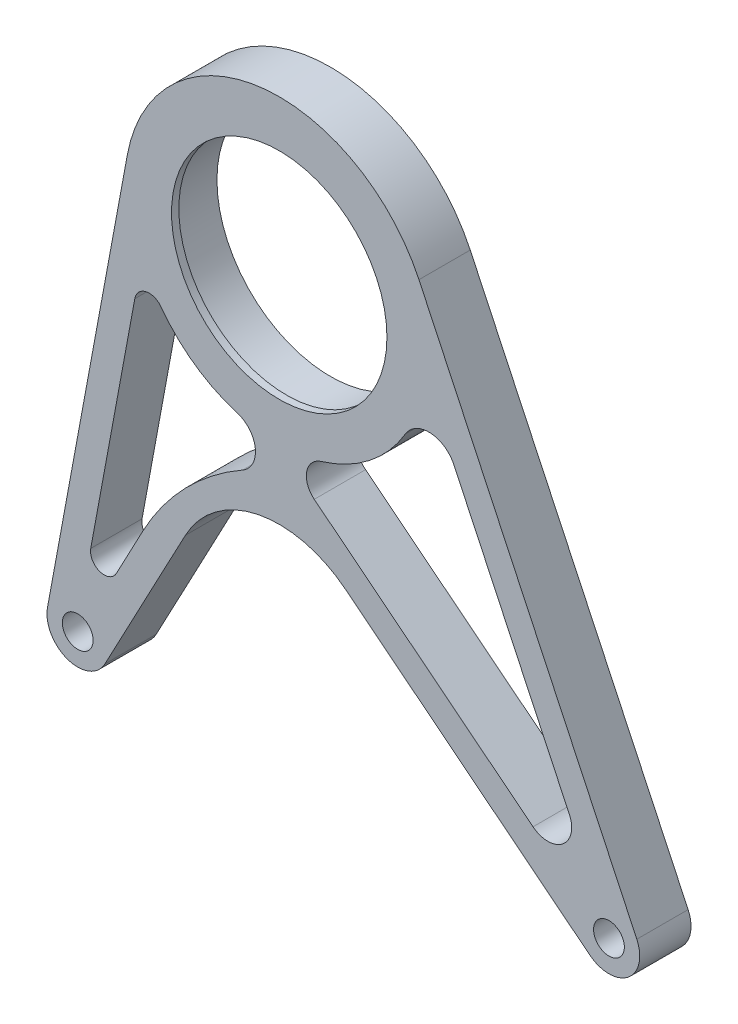
ISO-10303-21;
HEADER;
FILE_DESCRIPTION(('STEP AP214'),'2;1');
FILE_NAME('part.step','',(''),(''),'','','');
FILE_SCHEMA(('AUTOMOTIVE_DESIGN { 1 0 10303 214 1 1 1 1 }'));
ENDSEC;
DATA;
#1=APPLICATION_CONTEXT('core data for automotive mechanical design processes');
#2=APPLICATION_PROTOCOL_DEFINITION('international standard','automotive_design',2000,#1);
#3=PRODUCT_CONTEXT('',#1,'mechanical');
#4=PRODUCT('Part','Part','',(#3));
#5=PRODUCT_RELATED_PRODUCT_CATEGORY('part','',(#4));
#6=PRODUCT_DEFINITION_FORMATION('','',#4);
#7=PRODUCT_DEFINITION_CONTEXT('part definition',#1,'design');
#8=PRODUCT_DEFINITION('design','',#6,#7);
#9=PRODUCT_DEFINITION_SHAPE('','',#8);
#10=(LENGTH_UNIT() NAMED_UNIT(*) SI_UNIT(.MILLI.,.METRE.));
#11=(NAMED_UNIT(*) PLANE_ANGLE_UNIT() SI_UNIT($,.RADIAN.));
#12=(NAMED_UNIT(*) SI_UNIT($,.STERADIAN.) SOLID_ANGLE_UNIT());
#13=UNCERTAINTY_MEASURE_WITH_UNIT(LENGTH_MEASURE(1.E-05),#10,'distance_accuracy_value','');
#14=(GEOMETRIC_REPRESENTATION_CONTEXT(3) GLOBAL_UNCERTAINTY_ASSIGNED_CONTEXT((#13)) GLOBAL_UNIT_ASSIGNED_CONTEXT((#10,
#11,#12)) REPRESENTATION_CONTEXT('',''));
#15=CARTESIAN_POINT('',(0.,0.,0.));
#16=DIRECTION('',(0.,0.,1.));
#17=DIRECTION('',(1.,0.,0.));
#18=AXIS2_PLACEMENT_3D('',#15,#16,#17);
#19=CARTESIAN_POINT('',(0.,0.,-7.));
#20=DIRECTION('',(0.,0.,1.));
#21=DIRECTION('',(1.,0.,0.));
#22=AXIS2_PLACEMENT_3D('',#19,#20,#21);
#23=CYLINDRICAL_SURFACE('',#22,31.);
#24=CARTESIAN_POINT('',(0.,0.,-7.));
#25=DIRECTION('',(0.,0.,1.));
#26=DIRECTION('',(1.,0.,0.));
#27=AXIS2_PLACEMENT_3D('',#24,#25,#26);
#28=CIRCLE('',#27,31.);
#29=CARTESIAN_POINT('',(31.,0.,-7.));
#30=VERTEX_POINT('',#29);
#31=EDGE_CURVE('E345',#30,#30,#28,.T.);
#32=ORIENTED_EDGE('',*,*,#31,.F.);
#33=EDGE_LOOP('',(#32));
#34=FACE_BOUND('',#33,.T.);
#35=CARTESIAN_POINT('',(0.,0.,5.));
#36=DIRECTION('',(0.,0.,1.));
#37=DIRECTION('',(1.,0.,0.));
#38=AXIS2_PLACEMENT_3D('',#35,#36,#37);
#39=CIRCLE('',#38,31.);
#40=CARTESIAN_POINT('',(31.,0.,5.));
#41=VERTEX_POINT('',#40);
#42=EDGE_CURVE('E11',#41,#41,#39,.F.);
#43=ORIENTED_EDGE('',*,*,#42,.F.);
#44=EDGE_LOOP('',(#43));
#45=FACE_BOUND('',#44,.T.);
#46=ADVANCED_FACE('F47',(#34,#45),#23,.F.);
#47=CARTESIAN_POINT('',(0.,0.,7.));
#48=DIRECTION('',(0.,0.,-1.));
#49=DIRECTION('',(-1.,0.,0.));
#50=AXIS2_PLACEMENT_3D('',#47,#48,#49);
#51=CYLINDRICAL_SURFACE('',#50,42.16);
#52=CARTESIAN_POINT('',(0.,0.,-7.));
#53=DIRECTION('',(0.,0.,1.));
#54=DIRECTION('',(1.,0.,0.));
#55=AXIS2_PLACEMENT_3D('',#52,#53,#54);
#56=CIRCLE('',#55,42.16);
#57=CARTESIAN_POINT('',(38.1369015279032,17.973378698815,-7.));
#58=VERTEX_POINT('',#57);
#59=CARTESIAN_POINT('',(-41.4572657344942,7.66555397995015,-7.));
#60=VERTEX_POINT('',#59);
#61=EDGE_CURVE('E353',#58,#60,#56,.T.);
#62=ORIENTED_EDGE('',*,*,#61,.T.);
#63=DIRECTION('',(0.,0.,-1.));
#64=VECTOR('',#63,1.);
#65=CARTESIAN_POINT('',(-41.4572657344942,7.66555397995015,7.));
#66=LINE('',#65,#64);
#67=CARTESIAN_POINT('',(-41.4572657344942,7.66555397995015,7.));
#68=VERTEX_POINT('',#67);
#69=EDGE_CURVE('E56',#68,#60,#66,.T.);
#70=ORIENTED_EDGE('',*,*,#69,.F.);
#71=CARTESIAN_POINT('',(0.,0.,7.));
#72=DIRECTION('',(0.,0.,1.));
#73=DIRECTION('',(1.,0.,0.));
#74=AXIS2_PLACEMENT_3D('',#71,#72,#73);
#75=CIRCLE('',#74,42.16);
#76=CARTESIAN_POINT('',(38.1369015279032,17.973378698815,7.));
#77=VERTEX_POINT('',#76);
#78=EDGE_CURVE('E369',#77,#68,#75,.T.);
#79=ORIENTED_EDGE('',*,*,#78,.F.);
#80=DIRECTION('',(0.,0.,-1.));
#81=VECTOR('',#80,1.);
#82=CARTESIAN_POINT('',(38.1369015279032,17.973378698815,7.));
#83=LINE('',#82,#81);
#84=EDGE_CURVE('E397',#77,#58,#83,.T.);
#85=ORIENTED_EDGE('',*,*,#84,.T.);
#86=EDGE_LOOP('',(#62,#70,#79,#85));
#87=FACE_BOUND('',#86,.T.);
#88=ADVANCED_FACE('F49',(#87),#51,.T.);
#89=CARTESIAN_POINT('',(-41.4572657344942,7.66555397995015,7.));
#90=DIRECTION('',(0.983331729945309,-0.181820540321398,0.));
#91=DIRECTION('',(0.181820540321398,0.983331729945309,0.));
#92=AXIS2_PLACEMENT_3D('',#89,#90,#91);
#93=PLANE('',#92);
#94=DIRECTION('',(-0.181820540321398,-0.983331729945309,0.));
#95=VECTOR('',#94,1.);
#96=CARTESIAN_POINT('',(-41.4572657344942,7.66555397995015,-7.));
#97=LINE('',#96,#95);
#98=CARTESIAN_POINT('',(-63.2599865315406,-110.249105832283,-7.));
#99=VERTEX_POINT('',#98);
#100=EDGE_CURVE('E401',#60,#99,#97,.T.);
#101=ORIENTED_EDGE('',*,*,#100,.T.);
#102=DIRECTION('',(0.,0.,-1.));
#103=VECTOR('',#102,1.);
#104=CARTESIAN_POINT('',(-63.2599865315406,-110.249105832283,7.));
#105=LINE('',#104,#103);
#106=CARTESIAN_POINT('',(-63.2599865315406,-110.249105832283,7.));
#107=VERTEX_POINT('',#106);
#108=EDGE_CURVE('E445',#107,#99,#105,.T.);
#109=ORIENTED_EDGE('',*,*,#108,.F.);
#110=DIRECTION('',(-0.181820540321398,-0.983331729945309,0.));
#111=VECTOR('',#110,1.);
#112=CARTESIAN_POINT('',(-41.4572657344942,7.66555397995015,7.));
#113=LINE('',#112,#111);
#114=EDGE_CURVE('E373',#68,#107,#113,.T.);
#115=ORIENTED_EDGE('',*,*,#114,.F.);
#116=ORIENTED_EDGE('',*,*,#69,.T.);
#117=EDGE_LOOP('',(#101,#109,#115,#116));
#118=FACE_BOUND('',#117,.T.);
#119=ADVANCED_FACE('F451',(#118),#93,.F.);
#120=CARTESIAN_POINT('',(-55.,-111.776398370983,7.));
#121=DIRECTION('',(0.,0.,-1.));
#122=DIRECTION('',(-1.,0.,0.));
#123=AXIS2_PLACEMENT_3D('',#120,#121,#122);
#124=CYLINDRICAL_SURFACE('',#123,8.4);
#125=CARTESIAN_POINT('',(-55.,-111.776398370983,-7.));
#126=DIRECTION('',(0.,0.,-1.));
#127=DIRECTION('',(-1.,0.,0.));
#128=AXIS2_PLACEMENT_3D('',#125,#126,#127);
#129=CIRCLE('',#128,8.4);
#130=CARTESIAN_POINT('',(-47.5799810619532,-115.713823793645,-7.));
#131=VERTEX_POINT('',#130);
#132=EDGE_CURVE('E405',#131,#99,#129,.T.);
#133=ORIENTED_EDGE('',*,*,#132,.F.);
#134=DIRECTION('',(0.,0.,-1.));
#135=VECTOR('',#134,1.);
#136=CARTESIAN_POINT('',(-47.5799810619532,-115.713823793645,7.));
#137=LINE('',#136,#135);
#138=CARTESIAN_POINT('',(-47.5799810619532,-115.713823793645,7.));
#139=VERTEX_POINT('',#138);
#140=EDGE_CURVE('E442',#139,#131,#137,.T.);
#141=ORIENTED_EDGE('',*,*,#140,.F.);
#142=CARTESIAN_POINT('',(-55.,-111.776398370983,7.));
#143=DIRECTION('',(0.,0.,-1.));
#144=DIRECTION('',(-1.,0.,0.));
#145=AXIS2_PLACEMENT_3D('',#142,#143,#144);
#146=CIRCLE('',#145,8.4);
#147=EDGE_CURVE('E377',#139,#107,#146,.T.);
#148=ORIENTED_EDGE('',*,*,#147,.T.);
#149=ORIENTED_EDGE('',*,*,#108,.T.);
#150=EDGE_LOOP('',(#133,#141,#148,#149));
#151=FACE_BOUND('',#150,.T.);
#152=ADVANCED_FACE('F464',(#151),#124,.T.);
#153=CARTESIAN_POINT('',(-47.5799810619532,-115.713823793645,7.));
#154=DIRECTION('',(-0.883335587862711,0.468741121745509,0.));
#155=DIRECTION('',(-0.468741121745509,-0.883335587862711,0.));
#156=AXIS2_PLACEMENT_3D('',#153,#154,#155);
#157=PLANE('',#156);
#158=DIRECTION('',(0.468741121745509,0.883335587862711,0.));
#159=VECTOR('',#158,1.);
#160=CARTESIAN_POINT('',(-47.5799810619532,-115.713823793645,-7.));
#161=LINE('',#160,#159);
#162=CARTESIAN_POINT('',(-25.6167320480186,-74.3244116446675,-7.));
#163=VERTEX_POINT('',#162);
#164=EDGE_CURVE('E409',#131,#163,#161,.T.);
#165=ORIENTED_EDGE('',*,*,#164,.T.);
#166=DIRECTION('',(0.,0.,-1.));
#167=VECTOR('',#166,1.);
#168=CARTESIAN_POINT('',(-25.6167320480186,-74.3244116446675,7.));
#169=LINE('',#168,#167);
#170=CARTESIAN_POINT('',(-25.6167320480186,-74.3244116446675,7.));
#171=VERTEX_POINT('',#170);
#172=EDGE_CURVE('E439',#171,#163,#169,.T.);
#173=ORIENTED_EDGE('',*,*,#172,.F.);
#174=DIRECTION('',(0.468741121745509,0.883335587862711,0.));
#175=VECTOR('',#174,1.);
#176=CARTESIAN_POINT('',(-47.5799810619532,-115.713823793645,7.));
#177=LINE('',#176,#175);
#178=EDGE_CURVE('E381',#139,#171,#177,.T.);
#179=ORIENTED_EDGE('',*,*,#178,.F.);
#180=ORIENTED_EDGE('',*,*,#140,.T.);
#181=EDGE_LOOP('',(#165,#173,#179,#180));
#182=FACE_BOUND('',#181,.T.);
#183=ADVANCED_FACE('F486',(#182),#157,.F.);
#184=CARTESIAN_POINT('',(0.,-87.9179041752873,7.));
#185=DIRECTION('',(0.,0.,-1.));
#186=DIRECTION('',(-1.,0.,0.));
#187=AXIS2_PLACEMENT_3D('',#184,#185,#186);
#188=CYLINDRICAL_SURFACE('',#187,29.);
#189=CARTESIAN_POINT('',(0.,-87.9179041752873,-7.));
#190=DIRECTION('',(0.,0.,1.));
#191=DIRECTION('',(1.,0.,0.));
#192=AXIS2_PLACEMENT_3D('',#189,#190,#191);
#193=CIRCLE('',#192,29.);
#194=CARTESIAN_POINT('',(18.0650405444432,-65.2319104759224,-7.));
#195=VERTEX_POINT('',#194);
#196=EDGE_CURVE('E413',#195,#163,#193,.T.);
#197=ORIENTED_EDGE('',*,*,#196,.F.);
#198=DIRECTION('',(0.,0.,-1.));
#199=VECTOR('',#198,1.);
#200=CARTESIAN_POINT('',(18.0650405444432,-65.2319104759224,7.));
#201=LINE('',#200,#199);
#202=CARTESIAN_POINT('',(18.0650405444432,-65.2319104759224,7.));
#203=VERTEX_POINT('',#202);
#204=EDGE_CURVE('E436',#203,#195,#201,.T.);
#205=ORIENTED_EDGE('',*,*,#204,.F.);
#206=CARTESIAN_POINT('',(0.,-87.9179041752873,7.));
#207=DIRECTION('',(0.,0.,1.));
#208=DIRECTION('',(1.,0.,0.));
#209=AXIS2_PLACEMENT_3D('',#206,#207,#208);
#210=CIRCLE('',#209,29.);
#211=EDGE_CURVE('E384',#203,#171,#210,.T.);
#212=ORIENTED_EDGE('',*,*,#211,.T.);
#213=ORIENTED_EDGE('',*,*,#172,.T.);
#214=EDGE_LOOP('',(#197,#205,#212,#213));
#215=FACE_BOUND('',#214,.T.);
#216=ADVANCED_FACE('F483',(#215),#188,.F.);
#217=CARTESIAN_POINT('',(18.0650405444432,-65.2319104759224,7.));
#218=DIRECTION('',(0.622932432567007,0.782275644805686,0.));
#219=DIRECTION('',(-0.782275644805686,0.622932432567007,0.));
#220=AXIS2_PLACEMENT_3D('',#217,#218,#219);
#221=PLANE('',#220);
#222=DIRECTION('',(0.782275644805686,-0.622932432567007,0.));
#223=VECTOR('',#222,1.);
#224=CARTESIAN_POINT('',(18.0650405444432,-65.2319104759224,-7.));
#225=LINE('',#224,#223);
#226=CARTESIAN_POINT('',(84.7673675664371,-118.347513787351,-7.));
#227=VERTEX_POINT('',#226);
#228=EDGE_CURVE('E417',#195,#227,#225,.T.);
#229=ORIENTED_EDGE('',*,*,#228,.T.);
#230=DIRECTION('',(0.,0.,-1.));
#231=VECTOR('',#230,1.);
#232=CARTESIAN_POINT('',(84.7673675664371,-118.347513787351,7.));
#233=LINE('',#232,#231);
#234=CARTESIAN_POINT('',(84.7673675664371,-118.347513787351,7.));
#235=VERTEX_POINT('',#234);
#236=EDGE_CURVE('E432',#235,#227,#233,.T.);
#237=ORIENTED_EDGE('',*,*,#236,.F.);
#238=DIRECTION('',(0.782275644805686,-0.622932432567007,0.));
#239=VECTOR('',#238,1.);
#240=CARTESIAN_POINT('',(18.0650405444432,-65.2319104759224,7.));
#241=LINE('',#240,#239);
#242=EDGE_CURVE('E388',#203,#235,#241,.T.);
#243=ORIENTED_EDGE('',*,*,#242,.F.);
#244=ORIENTED_EDGE('',*,*,#204,.T.);
#245=EDGE_LOOP('',(#229,#237,#243,#244));
#246=FACE_BOUND('',#245,.T.);
#247=ADVANCED_FACE('F493',(#246),#221,.F.);
#248=CARTESIAN_POINT('',(90.,-111.776398370983,7.));
#249=DIRECTION('',(0.,0.,-1.));
#250=DIRECTION('',(-1.,0.,0.));
#251=AXIS2_PLACEMENT_3D('',#248,#249,#250);
#252=CYLINDRICAL_SURFACE('',#251,8.39999999999999);
#253=CARTESIAN_POINT('',(90.,-111.776398370983,-7.));
#254=DIRECTION('',(0.,0.,1.));
#255=DIRECTION('',(1.,0.,0.));
#256=AXIS2_PLACEMENT_3D('',#253,#254,#255);
#257=CIRCLE('',#256,8.39999999999999);
#258=CARTESIAN_POINT('',(97.5984338907587,-108.195364664388,-7.));
#259=VERTEX_POINT('',#258);
#260=EDGE_CURVE('E420',#227,#259,#257,.T.);
#261=ORIENTED_EDGE('',*,*,#260,.T.);
#262=DIRECTION('',(0.,0.,-1.));
#263=VECTOR('',#262,1.);
#264=CARTESIAN_POINT('',(97.5984338907587,-108.195364664388,7.));
#265=LINE('',#264,#263);
#266=CARTESIAN_POINT('',(97.5984338907587,-108.195364664388,7.));
#267=VERTEX_POINT('',#266);
#268=EDGE_CURVE('E428',#267,#259,#265,.T.);
#269=ORIENTED_EDGE('',*,*,#268,.F.);
#270=CARTESIAN_POINT('',(90.,-111.776398370983,7.));
#271=DIRECTION('',(0.,0.,1.));
#272=DIRECTION('',(1.,0.,0.));
#273=AXIS2_PLACEMENT_3D('',#270,#271,#272);
#274=CIRCLE('',#273,8.39999999999999);
#275=EDGE_CURVE('E391',#235,#267,#274,.T.);
#276=ORIENTED_EDGE('',*,*,#275,.F.);
#277=ORIENTED_EDGE('',*,*,#236,.T.);
#278=EDGE_LOOP('',(#261,#269,#276,#277));
#279=FACE_BOUND('',#278,.T.);
#280=ADVANCED_FACE('F477',(#279),#252,.T.);
#281=CARTESIAN_POINT('',(97.5984338907587,-108.195364664388,7.));
#282=DIRECTION('',(-0.904575463185559,-0.426313536499407,0.));
#283=DIRECTION('',(0.426313536499407,-0.904575463185559,0.));
#284=AXIS2_PLACEMENT_3D('',#281,#282,#283);
#285=PLANE('',#284);
#286=DIRECTION('',(-0.426313536499407,0.904575463185559,0.));
#287=VECTOR('',#286,1.);
#288=CARTESIAN_POINT('',(97.5984338907587,-108.195364664388,-7.));
#289=LINE('',#288,#287);
#290=EDGE_CURVE('E374',#259,#58,#289,.T.);
#291=ORIENTED_EDGE('',*,*,#290,.T.);
#292=ORIENTED_EDGE('',*,*,#84,.F.);
#293=DIRECTION('',(-0.426313536499407,0.904575463185559,0.));
#294=VECTOR('',#293,1.);
#295=CARTESIAN_POINT('',(97.5984338907587,-108.195364664388,7.));
#296=LINE('',#295,#294);
#297=EDGE_CURVE('E394',#267,#77,#296,.T.);
#298=ORIENTED_EDGE('',*,*,#297,.F.);
#299=ORIENTED_EDGE('',*,*,#268,.T.);
#300=EDGE_LOOP('',(#291,#292,#298,#299));
#301=FACE_BOUND('',#300,.T.);
#302=ADVANCED_FACE('F475',(#301),#285,.F.);
#303=CARTESIAN_POINT('',(0.,0.,7.));
#304=DIRECTION('',(0.,0.,1.));
#305=DIRECTION('',(1.,0.,0.));
#306=AXIS2_PLACEMENT_3D('',#303,#304,#305);
#307=PLANE('',#306);
#308=CARTESIAN_POINT('',(-13.4809619477753,-45.0251448077919,7.));
#309=DIRECTION('',(0.,0.,-1.));
#310=DIRECTION('',(-1.,0.,0.));
#311=AXIS2_PLACEMENT_3D('',#308,#309,#310);
#312=CIRCLE('',#311,7.);
#313=CARTESIAN_POINT('',(-11.4731591044896,-38.3192721768442,7.));
#314=VERTEX_POINT('',#313);
#315=CARTESIAN_POINT('',(-10.0182529245116,-51.1087002008337,7.));
#316=VERTEX_POINT('',#315);
#317=EDGE_CURVE('E195',#314,#316,#312,.T.);
#318=ORIENTED_EDGE('',*,*,#317,.T.);
#319=CARTESIAN_POINT('',(24.6088373081258,-111.944254131252,7.));
#320=DIRECTION('',(0.,0.,1.));
#321=DIRECTION('',(-1.,0.,0.));
#322=AXIS2_PLACEMENT_3D('',#319,#320,#321);
#323=CIRCLE('',#322,70.);
#324=CARTESIAN_POINT('',(-37.224653842264,-79.1323756090661,7.));
#325=VERTEX_POINT('',#324);
#326=EDGE_CURVE('E207',#316,#325,#323,.T.);
#327=ORIENTED_EDGE('',*,*,#326,.T.);
#328=DIRECTION('',(-0.468741121745509,-0.883335587862712,0.));
#329=VECTOR('',#328,1.);
#330=CARTESIAN_POINT('',(-44.4654610376625,-92.7775677712771,7.));
#331=LINE('',#330,#329);
#332=CARTESIAN_POINT('',(-44.4654610376625,-92.7775677712771,7.));
#333=VERTEX_POINT('',#332);
#334=EDGE_CURVE('E63',#325,#333,#331,.T.);
#335=ORIENTED_EDGE('',*,*,#334,.T.);
#336=CARTESIAN_POINT('',(-47.7678757327288,-91.0251448077919,7.));
#337=DIRECTION('',(0.,0.,-1.));
#338=DIRECTION('',(-1.,0.,0.));
#339=AXIS2_PLACEMENT_3D('',#336,#337,#338);
#340=CIRCLE('',#339,3.73857313170948);
#341=CARTESIAN_POINT('',(-51.4441333178597,-90.3453954209535,7.));
#342=VERTEX_POINT('',#341);
#343=EDGE_CURVE('E226',#333,#342,#340,.T.);
#344=ORIENTED_EDGE('',*,*,#343,.T.);
#345=DIRECTION('',(0.181820540321398,0.983331729945309,0.));
#346=VECTOR('',#345,1.);
#347=CARTESIAN_POINT('',(-39.4165998924763,-25.2974353321151,7.));
#348=LINE('',#347,#346);
#349=CARTESIAN_POINT('',(-39.4165998924763,-25.2974353321151,7.));
#350=VERTEX_POINT('',#349);
#351=EDGE_CURVE('E230',#342,#350,#348,.T.);
#352=ORIENTED_EDGE('',*,*,#351,.T.);
#353=CARTESIAN_POINT('',(-35.4809619477753,-26.0251448077919,7.));
#354=DIRECTION('',(0.,0.,-1.));
#355=DIRECTION('',(-1.,0.,0.));
#356=AXIS2_PLACEMENT_3D('',#353,#354,#355);
#357=CIRCLE('',#356,4.00235019866575);
#358=CARTESIAN_POINT('',(-32.2536971662492,-23.657958895642,7.));
#359=VERTEX_POINT('',#358);
#360=EDGE_CURVE('E234',#350,#359,#357,.T.);
#361=ORIENTED_EDGE('',*,*,#360,.T.);
#362=CARTESIAN_POINT('',(0.,0.,7.));
#363=DIRECTION('',(0.,0.,1.));
#364=DIRECTION('',(-1.,0.,0.));
#365=AXIS2_PLACEMENT_3D('',#362,#363,#364);
#366=CIRCLE('',#365,40.);
#367=EDGE_CURVE('E204',#359,#314,#366,.T.);
#368=ORIENTED_EDGE('',*,*,#367,.T.);
#369=EDGE_LOOP('',(#318,#327,#335,#344,#352,#361,#368));
#370=FACE_BOUND('',#369,.T.);
#371=CARTESIAN_POINT('',(40.8755506487877,-24.1958541729445,7.));
#372=DIRECTION('',(0.,0.,-1.));
#373=DIRECTION('',(-1.,0.,0.));
#374=AXIS2_PLACEMENT_3D('',#371,#372,#373);
#375=CIRCLE('',#374,7.5);
#376=CARTESIAN_POINT('',(34.4215163358212,-20.3754561456375,7.));
#377=VERTEX_POINT('',#376);
#378=CARTESIAN_POINT('',(47.6598666226794,-20.9985026491989,7.));
#379=VERTEX_POINT('',#378);
#380=EDGE_CURVE('E303',#377,#379,#375,.T.);
#381=ORIENTED_EDGE('',*,*,#380,.T.);
#382=DIRECTION('',(0.426313536499407,-0.904575463185559,0.));
#383=VECTOR('',#382,1.);
#384=CARTESIAN_POINT('',(47.6598666226794,-20.9985026491989,7.));
#385=LINE('',#384,#383);
#386=CARTESIAN_POINT('',(79.2024865500148,-87.9273650661568,7.));
#387=VERTEX_POINT('',#386);
#388=EDGE_CURVE('E334',#379,#387,#385,.T.);
#389=ORIENTED_EDGE('',*,*,#388,.T.);
#390=CARTESIAN_POINT('',(73.3227460393087,-90.6984030534029,7.));
#391=DIRECTION('',(0.,0.,-1.));
#392=DIRECTION('',(-1.,0.,0.));
#393=AXIS2_PLACEMENT_3D('',#390,#391,#392);
#394=CIRCLE('',#393,6.50000000000001);
#395=CARTESIAN_POINT('',(69.2736852276232,-95.7831947446399,7.));
#396=VERTEX_POINT('',#395);
#397=EDGE_CURVE('E71',#387,#396,#394,.T.);
#398=ORIENTED_EDGE('',*,*,#397,.T.);
#399=DIRECTION('',(-0.782275644805686,0.622932432567007,0.));
#400=VECTOR('',#399,1.);
#401=CARTESIAN_POINT('',(69.2736852276232,-95.7831947446399,7.));
#402=LINE('',#401,#400);
#403=CARTESIAN_POINT('',(9.55873044620315,-48.2316925476634,7.));
#404=VERTEX_POINT('',#403);
#405=EDGE_CURVE('E328',#396,#404,#402,.T.);
#406=ORIENTED_EDGE('',*,*,#405,.T.);
#407=CARTESIAN_POINT('',(13.1069227765763,-43.7758891602894,7.));
#408=DIRECTION('',(0.,0.,-1.));
#409=DIRECTION('',(-1.,0.,0.));
#410=AXIS2_PLACEMENT_3D('',#407,#408,#409);
#411=CIRCLE('',#410,5.69595054756029);
#412=CARTESIAN_POINT('',(11.4731591044896,-38.3192721768442,7.));
#413=VERTEX_POINT('',#412);
#414=EDGE_CURVE('E324',#404,#413,#411,.T.);
#415=ORIENTED_EDGE('',*,*,#414,.T.);
#416=CARTESIAN_POINT('',(0.,0.,7.));
#417=DIRECTION('',(0.,0.,1.));
#418=DIRECTION('',(-1.,0.,0.));
#419=AXIS2_PLACEMENT_3D('',#416,#417,#418);
#420=CIRCLE('',#419,40.);
#421=EDGE_CURVE('E282',#413,#377,#420,.T.);
#422=ORIENTED_EDGE('',*,*,#421,.T.);
#423=EDGE_LOOP('',(#381,#389,#398,#406,#415,#422));
#424=FACE_BOUND('',#423,.T.);
#425=CARTESIAN_POINT('',(-55.,-111.776398370983,7.));
#426=DIRECTION('',(0.,0.,1.));
#427=DIRECTION('',(1.,0.,0.));
#428=AXIS2_PLACEMENT_3D('',#425,#426,#427);
#429=CIRCLE('',#428,4.19999999999999);
#430=CARTESIAN_POINT('',(-50.8,-111.776398370983,7.));
#431=VERTEX_POINT('',#430);
#432=EDGE_CURVE('E354',#431,#431,#429,.T.);
#433=ORIENTED_EDGE('',*,*,#432,.F.);
#434=EDGE_LOOP('',(#433));
#435=FACE_BOUND('',#434,.T.);
#436=CARTESIAN_POINT('',(90.,-111.776398370983,7.));
#437=DIRECTION('',(0.,0.,1.));
#438=DIRECTION('',(1.,0.,0.));
#439=AXIS2_PLACEMENT_3D('',#436,#437,#438);
#440=CIRCLE('',#439,4.19999999999998);
#441=CARTESIAN_POINT('',(94.2,-111.776398370983,7.));
#442=VERTEX_POINT('',#441);
#443=EDGE_CURVE('E358',#442,#442,#440,.T.);
#444=ORIENTED_EDGE('',*,*,#443,.F.);
#445=EDGE_LOOP('',(#444));
#446=FACE_BOUND('',#445,.T.);
#447=ORIENTED_EDGE('',*,*,#78,.T.);
#448=ORIENTED_EDGE('',*,*,#114,.T.);
#449=ORIENTED_EDGE('',*,*,#147,.F.);
#450=ORIENTED_EDGE('',*,*,#178,.T.);
#451=ORIENTED_EDGE('',*,*,#211,.F.);
#452=ORIENTED_EDGE('',*,*,#242,.T.);
#453=ORIENTED_EDGE('',*,*,#275,.T.);
#454=ORIENTED_EDGE('',*,*,#297,.T.);
#455=EDGE_LOOP('',(#447,#448,#449,#450,#451,#452,#453,#454));
#456=FACE_BOUND('',#455,.T.);
#457=CARTESIAN_POINT('',(0.,0.,7.));
#458=DIRECTION('',(0.,0.,1.));
#459=DIRECTION('',(1.,0.,0.));
#460=AXIS2_PLACEMENT_3D('',#457,#458,#459);
#461=CIRCLE('',#460,29.4);
#462=CARTESIAN_POINT('',(29.4,0.,7.));
#463=VERTEX_POINT('',#462);
#464=EDGE_CURVE('E263',#463,#463,#461,.T.);
#465=ORIENTED_EDGE('',*,*,#464,.F.);
#466=EDGE_LOOP('',(#465));
#467=FACE_BOUND('',#466,.T.);
#468=ADVANCED_FACE('F212',(#370,#424,#435,#446,#456,#467),#307,.T.);
#469=CARTESIAN_POINT('',(0.,0.,-7.));
#470=DIRECTION('',(0.,0.,1.));
#471=DIRECTION('',(1.,0.,0.));
#472=AXIS2_PLACEMENT_3D('',#469,#470,#471);
#473=PLANE('',#472);
#474=CARTESIAN_POINT('',(24.6088373081258,-111.944254131252,-7.));
#475=DIRECTION('',(0.,0.,1.));
#476=DIRECTION('',(-1.,0.,0.));
#477=AXIS2_PLACEMENT_3D('',#474,#475,#476);
#478=CIRCLE('',#477,70.);
#479=CARTESIAN_POINT('',(-10.0182529245116,-51.1087002008337,-7.));
#480=VERTEX_POINT('',#479);
#481=CARTESIAN_POINT('',(-37.224653842264,-79.1323756090661,-7.));
#482=VERTEX_POINT('',#481);
#483=EDGE_CURVE('E241',#480,#482,#478,.T.);
#484=ORIENTED_EDGE('',*,*,#483,.F.);
#485=CARTESIAN_POINT('',(-13.4809619477753,-45.0251448077919,-7.));
#486=DIRECTION('',(0.,0.,-1.));
#487=DIRECTION('',(-1.,0.,0.));
#488=AXIS2_PLACEMENT_3D('',#485,#486,#487);
#489=CIRCLE('',#488,7.);
#490=CARTESIAN_POINT('',(-11.4731591044896,-38.3192721768442,-7.));
#491=VERTEX_POINT('',#490);
#492=EDGE_CURVE('E198',#491,#480,#489,.T.);
#493=ORIENTED_EDGE('',*,*,#492,.F.);
#494=CARTESIAN_POINT('',(0.,0.,-7.));
#495=DIRECTION('',(0.,0.,1.));
#496=DIRECTION('',(-1.,0.,0.));
#497=AXIS2_PLACEMENT_3D('',#494,#495,#496);
#498=CIRCLE('',#497,40.);
#499=CARTESIAN_POINT('',(-32.2536971662492,-23.657958895642,-7.));
#500=VERTEX_POINT('',#499);
#501=EDGE_CURVE('E217',#500,#491,#498,.T.);
#502=ORIENTED_EDGE('',*,*,#501,.F.);
#503=CARTESIAN_POINT('',(-35.4809619477753,-26.0251448077919,-7.));
#504=DIRECTION('',(0.,0.,-1.));
#505=DIRECTION('',(-1.,0.,0.));
#506=AXIS2_PLACEMENT_3D('',#503,#504,#505);
#507=CIRCLE('',#506,4.00235019866575);
#508=CARTESIAN_POINT('',(-39.4165998924763,-25.2974353321151,-7.));
#509=VERTEX_POINT('',#508);
#510=EDGE_CURVE('E221',#509,#500,#507,.T.);
#511=ORIENTED_EDGE('',*,*,#510,.F.);
#512=DIRECTION('',(0.181820540321398,0.983331729945309,0.));
#513=VECTOR('',#512,1.);
#514=CARTESIAN_POINT('',(-39.4165998924763,-25.2974353321151,-7.));
#515=LINE('',#514,#513);
#516=CARTESIAN_POINT('',(-51.4441333178597,-90.3453954209535,-7.));
#517=VERTEX_POINT('',#516);
#518=EDGE_CURVE('E253',#517,#509,#515,.T.);
#519=ORIENTED_EDGE('',*,*,#518,.F.);
#520=CARTESIAN_POINT('',(-47.7678757327288,-91.0251448077919,-7.));
#521=DIRECTION('',(0.,0.,-1.));
#522=DIRECTION('',(-1.,0.,0.));
#523=AXIS2_PLACEMENT_3D('',#520,#521,#522);
#524=CIRCLE('',#523,3.73857313170948);
#525=CARTESIAN_POINT('',(-44.4654610376625,-92.7775677712771,-7.));
#526=VERTEX_POINT('',#525);
#527=EDGE_CURVE('E249',#526,#517,#524,.T.);
#528=ORIENTED_EDGE('',*,*,#527,.F.);
#529=DIRECTION('',(-0.468741121745509,-0.883335587862712,0.));
#530=VECTOR('',#529,1.);
#531=CARTESIAN_POINT('',(-44.4654610376625,-92.7775677712771,-7.));
#532=LINE('',#531,#530);
#533=EDGE_CURVE('E245',#482,#526,#532,.T.);
#534=ORIENTED_EDGE('',*,*,#533,.F.);
#535=EDGE_LOOP('',(#484,#493,#502,#511,#519,#528,#534));
#536=FACE_BOUND('',#535,.T.);
#537=DIRECTION('',(0.426313536499407,-0.904575463185559,0.));
#538=VECTOR('',#537,1.);
#539=CARTESIAN_POINT('',(47.6598666226794,-20.9985026491989,-7.));
#540=LINE('',#539,#538);
#541=CARTESIAN_POINT('',(47.6598666226794,-20.9985026491989,-7.));
#542=VERTEX_POINT('',#541);
#543=CARTESIAN_POINT('',(79.2024865500148,-87.9273650661568,-7.));
#544=VERTEX_POINT('',#543);
#545=EDGE_CURVE('E315',#542,#544,#540,.T.);
#546=ORIENTED_EDGE('',*,*,#545,.F.);
#547=CARTESIAN_POINT('',(40.8755506487877,-24.1958541729445,-7.));
#548=DIRECTION('',(0.,0.,-1.));
#549=DIRECTION('',(-1.,0.,0.));
#550=AXIS2_PLACEMENT_3D('',#547,#548,#549);
#551=CIRCLE('',#550,7.5);
#552=CARTESIAN_POINT('',(34.4215163358212,-20.3754561456375,-7.));
#553=VERTEX_POINT('',#552);
#554=EDGE_CURVE('E242',#553,#542,#551,.T.);
#555=ORIENTED_EDGE('',*,*,#554,.F.);
#556=CARTESIAN_POINT('',(0.,0.,-7.));
#557=DIRECTION('',(0.,0.,1.));
#558=DIRECTION('',(-1.,0.,0.));
#559=AXIS2_PLACEMENT_3D('',#556,#557,#558);
#560=CIRCLE('',#559,40.);
#561=CARTESIAN_POINT('',(11.4731591044896,-38.3192721768442,-7.));
#562=VERTEX_POINT('',#561);
#563=EDGE_CURVE('E298',#562,#553,#560,.T.);
#564=ORIENTED_EDGE('',*,*,#563,.F.);
#565=CARTESIAN_POINT('',(13.1069227765763,-43.7758891602894,-7.));
#566=DIRECTION('',(0.,0.,-1.));
#567=DIRECTION('',(-1.,0.,0.));
#568=AXIS2_PLACEMENT_3D('',#565,#566,#567);
#569=CIRCLE('',#568,5.69595054756029);
#570=CARTESIAN_POINT('',(9.55873044620315,-48.2316925476634,-7.));
#571=VERTEX_POINT('',#570);
#572=EDGE_CURVE('E302',#571,#562,#569,.T.);
#573=ORIENTED_EDGE('',*,*,#572,.F.);
#574=DIRECTION('',(-0.782275644805686,0.622932432567007,0.));
#575=VECTOR('',#574,1.);
#576=CARTESIAN_POINT('',(69.2736852276232,-95.7831947446399,-7.));
#577=LINE('',#576,#575);
#578=CARTESIAN_POINT('',(69.2736852276232,-95.7831947446399,-7.));
#579=VERTEX_POINT('',#578);
#580=EDGE_CURVE('E307',#579,#571,#577,.T.);
#581=ORIENTED_EDGE('',*,*,#580,.F.);
#582=CARTESIAN_POINT('',(73.3227460393087,-90.6984030534029,-7.));
#583=DIRECTION('',(0.,0.,-1.));
#584=DIRECTION('',(-1.,0.,0.));
#585=AXIS2_PLACEMENT_3D('',#582,#583,#584);
#586=CIRCLE('',#585,6.50000000000001);
#587=EDGE_CURVE('E311',#544,#579,#586,.T.);
#588=ORIENTED_EDGE('',*,*,#587,.F.);
#589=EDGE_LOOP('',(#546,#555,#564,#573,#581,#588));
#590=FACE_BOUND('',#589,.T.);
#591=CARTESIAN_POINT('',(-55.,-111.776398370983,-7.));
#592=DIRECTION('',(0.,0.,1.));
#593=DIRECTION('',(1.,0.,0.));
#594=AXIS2_PLACEMENT_3D('',#591,#592,#593);
#595=CIRCLE('',#594,4.19999999999999);
#596=CARTESIAN_POINT('',(-50.8,-111.776398370983,-7.));
#597=VERTEX_POINT('',#596);
#598=EDGE_CURVE('E349',#597,#597,#595,.T.);
#599=ORIENTED_EDGE('',*,*,#598,.T.);
#600=EDGE_LOOP('',(#599));
#601=FACE_BOUND('',#600,.T.);
#602=CARTESIAN_POINT('',(90.,-111.776398370983,-7.));
#603=DIRECTION('',(0.,0.,1.));
#604=DIRECTION('',(1.,0.,0.));
#605=AXIS2_PLACEMENT_3D('',#602,#603,#604);
#606=CIRCLE('',#605,4.19999999999998);
#607=CARTESIAN_POINT('',(94.2,-111.776398370983,-7.));
#608=VERTEX_POINT('',#607);
#609=EDGE_CURVE('E362',#608,#608,#606,.T.);
#610=ORIENTED_EDGE('',*,*,#609,.T.);
#611=EDGE_LOOP('',(#610));
#612=FACE_BOUND('',#611,.T.);
#613=ORIENTED_EDGE('',*,*,#31,.T.);
#614=EDGE_LOOP('',(#613));
#615=FACE_BOUND('',#614,.T.);
#616=ORIENTED_EDGE('',*,*,#61,.F.);
#617=ORIENTED_EDGE('',*,*,#290,.F.);
#618=ORIENTED_EDGE('',*,*,#260,.F.);
#619=ORIENTED_EDGE('',*,*,#228,.F.);
#620=ORIENTED_EDGE('',*,*,#196,.T.);
#621=ORIENTED_EDGE('',*,*,#164,.F.);
#622=ORIENTED_EDGE('',*,*,#132,.T.);
#623=ORIENTED_EDGE('',*,*,#100,.F.);
#624=EDGE_LOOP('',(#616,#617,#618,#619,#620,#621,#622,#623));
#625=FACE_BOUND('',#624,.T.);
#626=ADVANCED_FACE('F459',(#536,#590,#601,#612,#615,#625),#473,.F.);
#627=CARTESIAN_POINT('',(90.,-111.776398370983,-7.));
#628=DIRECTION('',(0.,0.,1.));
#629=DIRECTION('',(1.,0.,0.));
#630=AXIS2_PLACEMENT_3D('',#627,#628,#629);
#631=CYLINDRICAL_SURFACE('',#630,4.19999999999998);
#632=ORIENTED_EDGE('',*,*,#609,.F.);
#633=EDGE_LOOP('',(#632));
#634=FACE_BOUND('',#633,.T.);
#635=ORIENTED_EDGE('',*,*,#443,.T.);
#636=EDGE_LOOP('',(#635));
#637=FACE_BOUND('',#636,.T.);
#638=ADVANCED_FACE('F506',(#634,#637),#631,.F.);
#639=CARTESIAN_POINT('',(-55.,-111.776398370983,-7.));
#640=DIRECTION('',(0.,0.,1.));
#641=DIRECTION('',(1.,0.,0.));
#642=AXIS2_PLACEMENT_3D('',#639,#640,#641);
#643=CYLINDRICAL_SURFACE('',#642,4.19999999999999);
#644=ORIENTED_EDGE('',*,*,#598,.F.);
#645=EDGE_LOOP('',(#644));
#646=FACE_BOUND('',#645,.T.);
#647=ORIENTED_EDGE('',*,*,#432,.T.);
#648=EDGE_LOOP('',(#647));
#649=FACE_BOUND('',#648,.T.);
#650=ADVANCED_FACE('F546',(#646,#649),#643,.F.);
#651=CARTESIAN_POINT('',(0.,0.,5.));
#652=DIRECTION('',(0.,0.,1.));
#653=DIRECTION('',(1.,0.,0.));
#654=AXIS2_PLACEMENT_3D('',#651,#652,#653);
#655=PLANE('',#654);
#656=CARTESIAN_POINT('',(0.,0.,5.));
#657=DIRECTION('',(0.,0.,1.));
#658=DIRECTION('',(1.,0.,0.));
#659=AXIS2_PLACEMENT_3D('',#656,#657,#658);
#660=CIRCLE('',#659,29.4);
#661=CARTESIAN_POINT('',(29.4,0.,5.));
#662=VERTEX_POINT('',#661);
#663=EDGE_CURVE('E341',#662,#662,#660,.T.);
#664=ORIENTED_EDGE('',*,*,#663,.T.);
#665=EDGE_LOOP('',(#664));
#666=FACE_BOUND('',#665,.T.);
#667=ORIENTED_EDGE('',*,*,#42,.T.);
#668=EDGE_LOOP('',(#667));
#669=FACE_BOUND('',#668,.T.);
#670=ADVANCED_FACE('F553',(#666,#669),#655,.F.);
#671=CARTESIAN_POINT('',(0.,0.,5.));
#672=DIRECTION('',(0.,0.,1.));
#673=DIRECTION('',(1.,0.,0.));
#674=AXIS2_PLACEMENT_3D('',#671,#672,#673);
#675=CYLINDRICAL_SURFACE('',#674,29.4);
#676=ORIENTED_EDGE('',*,*,#663,.F.);
#677=EDGE_LOOP('',(#676));
#678=FACE_BOUND('',#677,.T.);
#679=ORIENTED_EDGE('',*,*,#464,.T.);
#680=EDGE_LOOP('',(#679));
#681=FACE_BOUND('',#680,.T.);
#682=ADVANCED_FACE('F561',(#678,#681),#675,.F.);
#683=CARTESIAN_POINT('',(40.8755506487877,-24.1958541729445,7.));
#684=DIRECTION('',(0.,0.,-1.));
#685=DIRECTION('',(-1.,0.,0.));
#686=AXIS2_PLACEMENT_3D('',#683,#684,#685);
#687=CYLINDRICAL_SURFACE('',#686,7.5);
#688=ORIENTED_EDGE('',*,*,#554,.T.);
#689=DIRECTION('',(0.,0.,-1.));
#690=VECTOR('',#689,1.);
#691=CARTESIAN_POINT('',(47.6598666226794,-20.9985026491989,7.));
#692=LINE('',#691,#690);
#693=EDGE_CURVE('E278',#379,#542,#692,.T.);
#694=ORIENTED_EDGE('',*,*,#693,.F.);
#695=ORIENTED_EDGE('',*,*,#380,.F.);
#696=DIRECTION('',(0.,0.,-1.));
#697=VECTOR('',#696,1.);
#698=CARTESIAN_POINT('',(34.4215163358212,-20.3754561456375,7.));
#699=LINE('',#698,#697);
#700=EDGE_CURVE('E295',#377,#553,#699,.T.);
#701=ORIENTED_EDGE('',*,*,#700,.T.);
#702=EDGE_LOOP('',(#688,#694,#695,#701));
#703=FACE_BOUND('',#702,.T.);
#704=ADVANCED_FACE('F568',(#703),#687,.F.);
#705=CARTESIAN_POINT('',(0.,0.,7.));
#706=DIRECTION('',(0.,0.,-1.));
#707=DIRECTION('',(-1.,0.,0.));
#708=AXIS2_PLACEMENT_3D('',#705,#706,#707);
#709=CYLINDRICAL_SURFACE('',#708,40.);
#710=ORIENTED_EDGE('',*,*,#563,.T.);
#711=ORIENTED_EDGE('',*,*,#700,.F.);
#712=ORIENTED_EDGE('',*,*,#421,.F.);
#713=DIRECTION('',(0.,0.,-1.));
#714=VECTOR('',#713,1.);
#715=CARTESIAN_POINT('',(11.4731591044896,-38.3192721768442,7.));
#716=LINE('',#715,#714);
#717=EDGE_CURVE('E292',#413,#562,#716,.T.);
#718=ORIENTED_EDGE('',*,*,#717,.T.);
#719=EDGE_LOOP('',(#710,#711,#712,#718));
#720=FACE_BOUND('',#719,.T.);
#721=ADVANCED_FACE('F575',(#720),#709,.T.);
#722=CARTESIAN_POINT('',(13.1069227765763,-43.7758891602894,7.));
#723=DIRECTION('',(0.,0.,-1.));
#724=DIRECTION('',(-1.,0.,0.));
#725=AXIS2_PLACEMENT_3D('',#722,#723,#724);
#726=CYLINDRICAL_SURFACE('',#725,5.69595054756029);
#727=ORIENTED_EDGE('',*,*,#572,.T.);
#728=ORIENTED_EDGE('',*,*,#717,.F.);
#729=ORIENTED_EDGE('',*,*,#414,.F.);
#730=DIRECTION('',(0.,0.,-1.));
#731=VECTOR('',#730,1.);
#732=CARTESIAN_POINT('',(9.55873044620315,-48.2316925476634,7.));
#733=LINE('',#732,#731);
#734=EDGE_CURVE('E289',#404,#571,#733,.T.);
#735=ORIENTED_EDGE('',*,*,#734,.T.);
#736=EDGE_LOOP('',(#727,#728,#729,#735));
#737=FACE_BOUND('',#736,.T.);
#738=ADVANCED_FACE('F583',(#737),#726,.F.);
#739=CARTESIAN_POINT('',(69.2736852276232,-95.7831947446399,7.));
#740=DIRECTION('',(-0.622932432567007,-0.782275644805686,0.));
#741=DIRECTION('',(0.782275644805686,-0.622932432567007,0.));
#742=AXIS2_PLACEMENT_3D('',#739,#740,#741);
#743=PLANE('',#742);
#744=ORIENTED_EDGE('',*,*,#580,.T.);
#745=ORIENTED_EDGE('',*,*,#734,.F.);
#746=ORIENTED_EDGE('',*,*,#405,.F.);
#747=DIRECTION('',(0.,0.,-1.));
#748=VECTOR('',#747,1.);
#749=CARTESIAN_POINT('',(69.2736852276232,-95.7831947446399,7.));
#750=LINE('',#749,#748);
#751=EDGE_CURVE('E286',#396,#579,#750,.T.);
#752=ORIENTED_EDGE('',*,*,#751,.T.);
#753=EDGE_LOOP('',(#744,#745,#746,#752));
#754=FACE_BOUND('',#753,.T.);
#755=ADVANCED_FACE('F591',(#754),#743,.F.);
#756=CARTESIAN_POINT('',(73.3227460393087,-90.6984030534029,7.));
#757=DIRECTION('',(0.,0.,-1.));
#758=DIRECTION('',(-1.,0.,0.));
#759=AXIS2_PLACEMENT_3D('',#756,#757,#758);
#760=CYLINDRICAL_SURFACE('',#759,6.50000000000001);
#761=ORIENTED_EDGE('',*,*,#587,.T.);
#762=ORIENTED_EDGE('',*,*,#751,.F.);
#763=ORIENTED_EDGE('',*,*,#397,.F.);
#764=DIRECTION('',(0.,0.,-1.));
#765=VECTOR('',#764,1.);
#766=CARTESIAN_POINT('',(79.2024865500148,-87.9273650661568,7.));
#767=LINE('',#766,#765);
#768=EDGE_CURVE('E283',#387,#544,#767,.T.);
#769=ORIENTED_EDGE('',*,*,#768,.T.);
#770=EDGE_LOOP('',(#761,#762,#763,#769));
#771=FACE_BOUND('',#770,.T.);
#772=ADVANCED_FACE('F599',(#771),#760,.F.);
#773=CARTESIAN_POINT('',(47.6598666226794,-20.9985026491989,7.));
#774=DIRECTION('',(0.904575463185559,0.426313536499407,0.));
#775=DIRECTION('',(-0.426313536499407,0.904575463185559,0.));
#776=AXIS2_PLACEMENT_3D('',#773,#774,#775);
#777=PLANE('',#776);
#778=ORIENTED_EDGE('',*,*,#545,.T.);
#779=ORIENTED_EDGE('',*,*,#768,.F.);
#780=ORIENTED_EDGE('',*,*,#388,.F.);
#781=ORIENTED_EDGE('',*,*,#693,.T.);
#782=EDGE_LOOP('',(#778,#779,#780,#781));
#783=FACE_BOUND('',#782,.T.);
#784=ADVANCED_FACE('F607',(#783),#777,.F.);
#785=CARTESIAN_POINT('',(-13.4809619477753,-45.0251448077919,7.));
#786=DIRECTION('',(0.,0.,-1.));
#787=DIRECTION('',(-1.,0.,0.));
#788=AXIS2_PLACEMENT_3D('',#785,#786,#787);
#789=CYLINDRICAL_SURFACE('',#788,7.);
#790=ORIENTED_EDGE('',*,*,#492,.T.);
#791=DIRECTION('',(0.,0.,-1.));
#792=VECTOR('',#791,1.);
#793=CARTESIAN_POINT('',(-10.0182529245116,-51.1087002008337,7.));
#794=LINE('',#793,#792);
#795=EDGE_CURVE('E191',#316,#480,#794,.T.);
#796=ORIENTED_EDGE('',*,*,#795,.F.);
#797=ORIENTED_EDGE('',*,*,#317,.F.);
#798=DIRECTION('',(0.,0.,-1.));
#799=VECTOR('',#798,1.);
#800=CARTESIAN_POINT('',(-11.4731591044896,-38.3192721768442,7.));
#801=LINE('',#800,#799);
#802=EDGE_CURVE('E260',#314,#491,#801,.T.);
#803=ORIENTED_EDGE('',*,*,#802,.T.);
#804=EDGE_LOOP('',(#790,#796,#797,#803));
#805=FACE_BOUND('',#804,.T.);
#806=ADVANCED_FACE('F193',(#805),#789,.F.);
#807=CARTESIAN_POINT('',(0.,0.,7.));
#808=DIRECTION('',(0.,0.,-1.));
#809=DIRECTION('',(-1.,0.,0.));
#810=AXIS2_PLACEMENT_3D('',#807,#808,#809);
#811=CYLINDRICAL_SURFACE('',#810,40.);
#812=ORIENTED_EDGE('',*,*,#501,.T.);
#813=ORIENTED_EDGE('',*,*,#802,.F.);
#814=ORIENTED_EDGE('',*,*,#367,.F.);
#815=DIRECTION('',(0.,0.,-1.));
#816=VECTOR('',#815,1.);
#817=CARTESIAN_POINT('',(-32.2536971662492,-23.657958895642,7.));
#818=LINE('',#817,#816);
#819=EDGE_CURVE('E264',#359,#500,#818,.T.);
#820=ORIENTED_EDGE('',*,*,#819,.T.);
#821=EDGE_LOOP('',(#812,#813,#814,#820));
#822=FACE_BOUND('',#821,.T.);
#823=ADVANCED_FACE('F621',(#822),#811,.T.);
#824=CARTESIAN_POINT('',(-35.4809619477753,-26.0251448077919,7.));
#825=DIRECTION('',(0.,0.,-1.));
#826=DIRECTION('',(-1.,0.,0.));
#827=AXIS2_PLACEMENT_3D('',#824,#825,#826);
#828=CYLINDRICAL_SURFACE('',#827,4.00235019866575);
#829=ORIENTED_EDGE('',*,*,#510,.T.);
#830=ORIENTED_EDGE('',*,*,#819,.F.);
#831=ORIENTED_EDGE('',*,*,#360,.F.);
#832=DIRECTION('',(0.,0.,-1.));
#833=VECTOR('',#832,1.);
#834=CARTESIAN_POINT('',(-39.4165998924763,-25.2974353321151,7.));
#835=LINE('',#834,#833);
#836=EDGE_CURVE('E267',#350,#509,#835,.T.);
#837=ORIENTED_EDGE('',*,*,#836,.T.);
#838=EDGE_LOOP('',(#829,#830,#831,#837));
#839=FACE_BOUND('',#838,.T.);
#840=ADVANCED_FACE('F628',(#839),#828,.F.);
#841=CARTESIAN_POINT('',(-39.4165998924763,-25.2974353321151,7.));
#842=DIRECTION('',(-0.983331729945309,0.181820540321398,0.));
#843=DIRECTION('',(-0.181820540321398,-0.983331729945309,0.));
#844=AXIS2_PLACEMENT_3D('',#841,#842,#843);
#845=PLANE('',#844);
#846=ORIENTED_EDGE('',*,*,#518,.T.);
#847=ORIENTED_EDGE('',*,*,#836,.F.);
#848=ORIENTED_EDGE('',*,*,#351,.F.);
#849=DIRECTION('',(0.,0.,-1.));
#850=VECTOR('',#849,1.);
#851=CARTESIAN_POINT('',(-51.4441333178597,-90.3453954209535,7.));
#852=LINE('',#851,#850);
#853=EDGE_CURVE('E270',#342,#517,#852,.T.);
#854=ORIENTED_EDGE('',*,*,#853,.T.);
#855=EDGE_LOOP('',(#846,#847,#848,#854));
#856=FACE_BOUND('',#855,.T.);
#857=ADVANCED_FACE('F636',(#856),#845,.F.);
#858=CARTESIAN_POINT('',(-47.7678757327288,-91.0251448077919,7.));
#859=DIRECTION('',(0.,0.,-1.));
#860=DIRECTION('',(-1.,0.,0.));
#861=AXIS2_PLACEMENT_3D('',#858,#859,#860);
#862=CYLINDRICAL_SURFACE('',#861,3.73857313170948);
#863=ORIENTED_EDGE('',*,*,#527,.T.);
#864=ORIENTED_EDGE('',*,*,#853,.F.);
#865=ORIENTED_EDGE('',*,*,#343,.F.);
#866=DIRECTION('',(0.,0.,-1.));
#867=VECTOR('',#866,1.);
#868=CARTESIAN_POINT('',(-44.4654610376625,-92.7775677712771,7.));
#869=LINE('',#868,#867);
#870=EDGE_CURVE('E273',#333,#526,#869,.T.);
#871=ORIENTED_EDGE('',*,*,#870,.T.);
#872=EDGE_LOOP('',(#863,#864,#865,#871));
#873=FACE_BOUND('',#872,.T.);
#874=ADVANCED_FACE('F644',(#873),#862,.F.);
#875=CARTESIAN_POINT('',(-44.4654610376625,-92.7775677712771,7.));
#876=DIRECTION('',(0.883335587862712,-0.468741121745509,0.));
#877=DIRECTION('',(0.468741121745509,0.883335587862712,0.));
#878=AXIS2_PLACEMENT_3D('',#875,#876,#877);
#879=PLANE('',#878);
#880=ORIENTED_EDGE('',*,*,#533,.T.);
#881=ORIENTED_EDGE('',*,*,#870,.F.);
#882=ORIENTED_EDGE('',*,*,#334,.F.);
#883=DIRECTION('',(0.,0.,-1.));
#884=VECTOR('',#883,1.);
#885=CARTESIAN_POINT('',(-37.224653842264,-79.1323756090661,7.));
#886=LINE('',#885,#884);
#887=EDGE_CURVE('E203',#325,#482,#886,.T.);
#888=ORIENTED_EDGE('',*,*,#887,.T.);
#889=EDGE_LOOP('',(#880,#881,#882,#888));
#890=FACE_BOUND('',#889,.T.);
#891=ADVANCED_FACE('F652',(#890),#879,.F.);
#892=CARTESIAN_POINT('',(24.6088373081258,-111.944254131252,7.));
#893=DIRECTION('',(0.,0.,-1.));
#894=DIRECTION('',(-1.,0.,0.));
#895=AXIS2_PLACEMENT_3D('',#892,#893,#894);
#896=CYLINDRICAL_SURFACE('',#895,70.);
#897=ORIENTED_EDGE('',*,*,#483,.T.);
#898=ORIENTED_EDGE('',*,*,#887,.F.);
#899=ORIENTED_EDGE('',*,*,#326,.F.);
#900=ORIENTED_EDGE('',*,*,#795,.T.);
#901=EDGE_LOOP('',(#897,#898,#899,#900));
#902=FACE_BOUND('',#901,.T.);
#903=ADVANCED_FACE('F208',(#902),#896,.T.);
#904=CLOSED_SHELL('',(#46,#88,#119,#152,#183,#216,#247,#280,#302,#468,#626,#638,#650,#670,#682,
#704,#721,#738,#755,#772,#784,#806,#823,#840,#857,#874,#891,#903));
#905=MANIFOLD_SOLID_BREP('B2',#904);
#906=ADVANCED_BREP_SHAPE_REPRESENTATION('',(#18,#905),#14);
#907=SHAPE_DEFINITION_REPRESENTATION(#9,#906);
ENDSEC;
END-ISO-10303-21;
